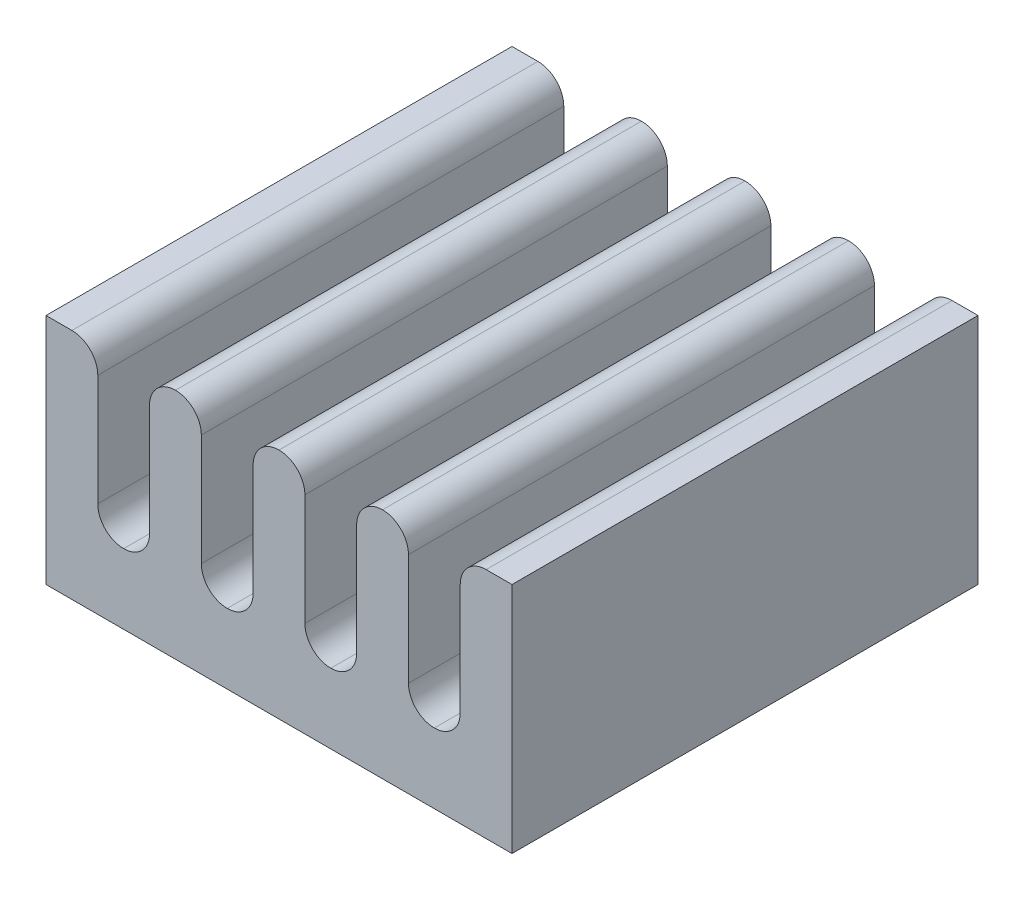
ISO-10303-21;
HEADER;
FILE_DESCRIPTION(('STEP AP214'),'2;1');
FILE_NAME('part.step','',(''),(''),'','','');
FILE_SCHEMA(('AUTOMOTIVE_DESIGN { 1 0 10303 214 1 1 1 1 }'));
ENDSEC;
DATA;
#1=APPLICATION_CONTEXT('core data for automotive mechanical design processes');
#2=APPLICATION_PROTOCOL_DEFINITION('international standard','automotive_design',2000,#1);
#3=PRODUCT_CONTEXT('',#1,'mechanical');
#4=PRODUCT('Part','Part','',(#3));
#5=PRODUCT_RELATED_PRODUCT_CATEGORY('part','',(#4));
#6=PRODUCT_DEFINITION_FORMATION('','',#4);
#7=PRODUCT_DEFINITION_CONTEXT('part definition',#1,'design');
#8=PRODUCT_DEFINITION('design','',#6,#7);
#9=PRODUCT_DEFINITION_SHAPE('','',#8);
#10=(LENGTH_UNIT() NAMED_UNIT(*) SI_UNIT(.MILLI.,.METRE.));
#11=(NAMED_UNIT(*) PLANE_ANGLE_UNIT() SI_UNIT($,.RADIAN.));
#12=(NAMED_UNIT(*) SI_UNIT($,.STERADIAN.) SOLID_ANGLE_UNIT());
#13=UNCERTAINTY_MEASURE_WITH_UNIT(LENGTH_MEASURE(1.E-05),#10,'distance_accuracy_value','');
#14=(GEOMETRIC_REPRESENTATION_CONTEXT(3) GLOBAL_UNCERTAINTY_ASSIGNED_CONTEXT((#13)) GLOBAL_UNIT_ASSIGNED_CONTEXT((#10,
#11,#12)) REPRESENTATION_CONTEXT('',''));
#15=CARTESIAN_POINT('',(0.,0.,0.));
#16=DIRECTION('',(0.,0.,1.));
#17=DIRECTION('',(1.,0.,0.));
#18=AXIS2_PLACEMENT_3D('',#15,#16,#17);
#19=CARTESIAN_POINT('',(4.5,5.,-4.5));
#20=DIRECTION('',(-1.,0.,0.));
#21=DIRECTION('',(0.,0.,1.));
#22=AXIS2_PLACEMENT_3D('',#19,#20,#21);
#23=PLANE('',#22);
#24=DIRECTION('',(0.,0.,1.));
#25=VECTOR('',#24,1.);
#26=CARTESIAN_POINT('',(4.5,0.5,-4.5));
#27=LINE('',#26,#25);
#28=CARTESIAN_POINT('',(4.5,0.5,-4.5));
#29=VERTEX_POINT('',#28);
#30=CARTESIAN_POINT('',(4.5,0.5,4.5));
#31=VERTEX_POINT('',#30);
#32=EDGE_CURVE('E11',#29,#31,#27,.T.);
#33=ORIENTED_EDGE('',*,*,#32,.F.);
#34=DIRECTION('',(0.,-1.,0.));
#35=VECTOR('',#34,1.);
#36=CARTESIAN_POINT('',(4.5,5.,-4.5));
#37=LINE('',#36,#35);
#38=CARTESIAN_POINT('',(4.5,5.,-4.5));
#39=VERTEX_POINT('',#38);
#40=EDGE_CURVE('E23',#39,#29,#37,.T.);
#41=ORIENTED_EDGE('',*,*,#40,.F.);
#42=DIRECTION('',(0.,0.,-1.));
#43=VECTOR('',#42,1.);
#44=CARTESIAN_POINT('',(4.5,5.,-4.5));
#45=LINE('',#44,#43);
#46=CARTESIAN_POINT('',(4.5,5.,4.5));
#47=VERTEX_POINT('',#46);
#48=EDGE_CURVE('E478',#47,#39,#45,.T.);
#49=ORIENTED_EDGE('',*,*,#48,.F.);
#50=DIRECTION('',(0.,-1.,0.));
#51=VECTOR('',#50,1.);
#52=CARTESIAN_POINT('',(4.5,5.,4.5));
#53=LINE('',#52,#51);
#54=EDGE_CURVE('E476',#47,#31,#53,.T.);
#55=ORIENTED_EDGE('',*,*,#54,.T.);
#56=EDGE_LOOP('',(#33,#41,#49,#55));
#57=FACE_BOUND('',#56,.T.);
#58=ADVANCED_FACE('F16',(#57),#23,.F.);
#59=CARTESIAN_POINT('',(-4.5,5.,-4.5));
#60=DIRECTION('',(0.,0.,1.));
#61=DIRECTION('',(1.,0.,0.));
#62=AXIS2_PLACEMENT_3D('',#59,#60,#61);
#63=PLANE('',#62);
#64=DIRECTION('',(1.,0.,0.));
#65=VECTOR('',#64,1.);
#66=CARTESIAN_POINT('',(-4.5,0.5,-4.5));
#67=LINE('',#66,#65);
#68=CARTESIAN_POINT('',(-4.5,0.5,-4.5));
#69=VERTEX_POINT('',#68);
#70=EDGE_CURVE('E474',#69,#29,#67,.T.);
#71=ORIENTED_EDGE('',*,*,#70,.F.);
#72=DIRECTION('',(0.,-1.,0.));
#73=VECTOR('',#72,1.);
#74=CARTESIAN_POINT('',(-4.5,5.,-4.5));
#75=LINE('',#74,#73);
#76=CARTESIAN_POINT('',(-4.5,5.,-4.5));
#77=VERTEX_POINT('',#76);
#78=EDGE_CURVE('E471',#77,#69,#75,.T.);
#79=ORIENTED_EDGE('',*,*,#78,.F.);
#80=DIRECTION('',(-1.,0.,0.));
#81=VECTOR('',#80,1.);
#82=CARTESIAN_POINT('',(-4.5,5.,-4.5));
#83=LINE('',#82,#81);
#84=CARTESIAN_POINT('',(-4.,5.,-4.5));
#85=VERTEX_POINT('',#84);
#86=EDGE_CURVE('E468',#85,#77,#83,.T.);
#87=ORIENTED_EDGE('',*,*,#86,.F.);
#88=CARTESIAN_POINT('',(-4.,4.5,-4.5));
#89=DIRECTION('',(0.,0.,-1.));
#90=DIRECTION('',(1.,0.,0.));
#91=AXIS2_PLACEMENT_3D('',#88,#89,#90);
#92=CIRCLE('',#91,0.5);
#93=CARTESIAN_POINT('',(-3.5,4.5,-4.5));
#94=VERTEX_POINT('',#93);
#95=EDGE_CURVE('E466',#85,#94,#92,.T.);
#96=ORIENTED_EDGE('',*,*,#95,.T.);
#97=DIRECTION('',(0.,1.,0.));
#98=VECTOR('',#97,1.);
#99=CARTESIAN_POINT('',(-3.5,-9.05538513813741,-4.5));
#100=LINE('',#99,#98);
#101=CARTESIAN_POINT('',(-3.5,2.35,-4.5));
#102=VERTEX_POINT('',#101);
#103=EDGE_CURVE('E463',#102,#94,#100,.T.);
#104=ORIENTED_EDGE('',*,*,#103,.F.);
#105=CARTESIAN_POINT('',(-3.,2.35,-4.5));
#106=DIRECTION('',(0.,0.,1.));
#107=DIRECTION('',(1.,0.,0.));
#108=AXIS2_PLACEMENT_3D('',#105,#106,#107);
#109=CIRCLE('',#108,0.5);
#110=CARTESIAN_POINT('',(-3.,1.85,-4.5));
#111=VERTEX_POINT('',#110);
#112=EDGE_CURVE('E461',#102,#111,#109,.T.);
#113=ORIENTED_EDGE('',*,*,#112,.T.);
#114=CARTESIAN_POINT('',(-3.,2.35,-4.5));
#115=DIRECTION('',(0.,0.,1.));
#116=DIRECTION('',(1.,0.,0.));
#117=AXIS2_PLACEMENT_3D('',#114,#115,#116);
#118=CIRCLE('',#117,0.5);
#119=CARTESIAN_POINT('',(-2.5,2.35,-4.5));
#120=VERTEX_POINT('',#119);
#121=EDGE_CURVE('E459',#111,#120,#118,.T.);
#122=ORIENTED_EDGE('',*,*,#121,.T.);
#123=DIRECTION('',(0.,1.,0.));
#124=VECTOR('',#123,1.);
#125=CARTESIAN_POINT('',(-2.5,-9.05538513813741,-4.5));
#126=LINE('',#125,#124);
#127=CARTESIAN_POINT('',(-2.5,4.5,-4.5));
#128=VERTEX_POINT('',#127);
#129=EDGE_CURVE('E457',#120,#128,#126,.T.);
#130=ORIENTED_EDGE('',*,*,#129,.T.);
#131=CARTESIAN_POINT('',(-2.,4.5,-4.5));
#132=DIRECTION('',(0.,0.,-1.));
#133=DIRECTION('',(1.,0.,0.));
#134=AXIS2_PLACEMENT_3D('',#131,#132,#133);
#135=CIRCLE('',#134,0.5);
#136=CARTESIAN_POINT('',(-2.,5.,-4.5));
#137=VERTEX_POINT('',#136);
#138=EDGE_CURVE('E455',#128,#137,#135,.T.);
#139=ORIENTED_EDGE('',*,*,#138,.T.);
#140=CARTESIAN_POINT('',(-2.,4.5,-4.5));
#141=DIRECTION('',(0.,0.,-1.));
#142=DIRECTION('',(1.,0.,0.));
#143=AXIS2_PLACEMENT_3D('',#140,#141,#142);
#144=CIRCLE('',#143,0.5);
#145=CARTESIAN_POINT('',(-1.5,4.5,-4.5));
#146=VERTEX_POINT('',#145);
#147=EDGE_CURVE('E453',#137,#146,#144,.T.);
#148=ORIENTED_EDGE('',*,*,#147,.T.);
#149=DIRECTION('',(0.,1.,0.));
#150=VECTOR('',#149,1.);
#151=CARTESIAN_POINT('',(-1.5,-9.05538513813741,-4.5));
#152=LINE('',#151,#150);
#153=CARTESIAN_POINT('',(-1.5,2.35,-4.5));
#154=VERTEX_POINT('',#153);
#155=EDGE_CURVE('E450',#154,#146,#152,.T.);
#156=ORIENTED_EDGE('',*,*,#155,.F.);
#157=CARTESIAN_POINT('',(-1.,2.35,-4.5));
#158=DIRECTION('',(0.,0.,1.));
#159=DIRECTION('',(1.,0.,0.));
#160=AXIS2_PLACEMENT_3D('',#157,#158,#159);
#161=CIRCLE('',#160,0.5);
#162=CARTESIAN_POINT('',(-1.,1.85,-4.5));
#163=VERTEX_POINT('',#162);
#164=EDGE_CURVE('E448',#154,#163,#161,.T.);
#165=ORIENTED_EDGE('',*,*,#164,.T.);
#166=CARTESIAN_POINT('',(-1.,2.35,-4.5));
#167=DIRECTION('',(0.,0.,1.));
#168=DIRECTION('',(1.,0.,0.));
#169=AXIS2_PLACEMENT_3D('',#166,#167,#168);
#170=CIRCLE('',#169,0.5);
#171=CARTESIAN_POINT('',(-0.5,2.35,-4.5));
#172=VERTEX_POINT('',#171);
#173=EDGE_CURVE('E446',#163,#172,#170,.T.);
#174=ORIENTED_EDGE('',*,*,#173,.T.);
#175=DIRECTION('',(0.,1.,0.));
#176=VECTOR('',#175,1.);
#177=CARTESIAN_POINT('',(-0.5,-9.05538513813741,-4.5));
#178=LINE('',#177,#176);
#179=CARTESIAN_POINT('',(-0.5,4.5,-4.5));
#180=VERTEX_POINT('',#179);
#181=EDGE_CURVE('E444',#172,#180,#178,.T.);
#182=ORIENTED_EDGE('',*,*,#181,.T.);
#183=CARTESIAN_POINT('',(0.,4.5,-4.5));
#184=DIRECTION('',(0.,0.,-1.));
#185=DIRECTION('',(1.,0.,0.));
#186=AXIS2_PLACEMENT_3D('',#183,#184,#185);
#187=CIRCLE('',#186,0.5);
#188=CARTESIAN_POINT('',(0.,5.,-4.5));
#189=VERTEX_POINT('',#188);
#190=EDGE_CURVE('E442',#180,#189,#187,.T.);
#191=ORIENTED_EDGE('',*,*,#190,.T.);
#192=CARTESIAN_POINT('',(0.,4.5,-4.5));
#193=DIRECTION('',(0.,0.,-1.));
#194=DIRECTION('',(1.,0.,0.));
#195=AXIS2_PLACEMENT_3D('',#192,#193,#194);
#196=CIRCLE('',#195,0.5);
#197=CARTESIAN_POINT('',(0.5,4.5,-4.5));
#198=VERTEX_POINT('',#197);
#199=EDGE_CURVE('E440',#189,#198,#196,.T.);
#200=ORIENTED_EDGE('',*,*,#199,.T.);
#201=DIRECTION('',(0.,1.,0.));
#202=VECTOR('',#201,1.);
#203=CARTESIAN_POINT('',(0.5,-9.05538513813741,-4.5));
#204=LINE('',#203,#202);
#205=CARTESIAN_POINT('',(0.5,2.35,-4.5));
#206=VERTEX_POINT('',#205);
#207=EDGE_CURVE('E437',#206,#198,#204,.T.);
#208=ORIENTED_EDGE('',*,*,#207,.F.);
#209=CARTESIAN_POINT('',(1.,2.35,-4.5));
#210=DIRECTION('',(0.,0.,1.));
#211=DIRECTION('',(1.,0.,0.));
#212=AXIS2_PLACEMENT_3D('',#209,#210,#211);
#213=CIRCLE('',#212,0.5);
#214=CARTESIAN_POINT('',(1.,1.85,-4.5));
#215=VERTEX_POINT('',#214);
#216=EDGE_CURVE('E435',#206,#215,#213,.T.);
#217=ORIENTED_EDGE('',*,*,#216,.T.);
#218=CARTESIAN_POINT('',(1.,2.35,-4.5));
#219=DIRECTION('',(0.,0.,1.));
#220=DIRECTION('',(1.,0.,0.));
#221=AXIS2_PLACEMENT_3D('',#218,#219,#220);
#222=CIRCLE('',#221,0.5);
#223=CARTESIAN_POINT('',(1.5,2.35,-4.5));
#224=VERTEX_POINT('',#223);
#225=EDGE_CURVE('E433',#215,#224,#222,.T.);
#226=ORIENTED_EDGE('',*,*,#225,.T.);
#227=DIRECTION('',(0.,1.,0.));
#228=VECTOR('',#227,1.);
#229=CARTESIAN_POINT('',(1.5,-9.05538513813741,-4.5));
#230=LINE('',#229,#228);
#231=CARTESIAN_POINT('',(1.5,4.5,-4.5));
#232=VERTEX_POINT('',#231);
#233=EDGE_CURVE('E431',#224,#232,#230,.T.);
#234=ORIENTED_EDGE('',*,*,#233,.T.);
#235=CARTESIAN_POINT('',(2.,4.5,-4.5));
#236=DIRECTION('',(0.,0.,-1.));
#237=DIRECTION('',(1.,0.,0.));
#238=AXIS2_PLACEMENT_3D('',#235,#236,#237);
#239=CIRCLE('',#238,0.5);
#240=CARTESIAN_POINT('',(2.,5.,-4.5));
#241=VERTEX_POINT('',#240);
#242=EDGE_CURVE('E429',#232,#241,#239,.T.);
#243=ORIENTED_EDGE('',*,*,#242,.T.);
#244=CARTESIAN_POINT('',(2.,4.5,-4.5));
#245=DIRECTION('',(0.,0.,-1.));
#246=DIRECTION('',(1.,0.,0.));
#247=AXIS2_PLACEMENT_3D('',#244,#245,#246);
#248=CIRCLE('',#247,0.5);
#249=CARTESIAN_POINT('',(2.5,4.5,-4.5));
#250=VERTEX_POINT('',#249);
#251=EDGE_CURVE('E427',#241,#250,#248,.T.);
#252=ORIENTED_EDGE('',*,*,#251,.T.);
#253=DIRECTION('',(0.,1.,0.));
#254=VECTOR('',#253,1.);
#255=CARTESIAN_POINT('',(2.5,-9.05538513813741,-4.5));
#256=LINE('',#255,#254);
#257=CARTESIAN_POINT('',(2.5,2.35,-4.5));
#258=VERTEX_POINT('',#257);
#259=EDGE_CURVE('E424',#258,#250,#256,.T.);
#260=ORIENTED_EDGE('',*,*,#259,.F.);
#261=CARTESIAN_POINT('',(3.,2.35,-4.5));
#262=DIRECTION('',(0.,0.,1.));
#263=DIRECTION('',(1.,0.,0.));
#264=AXIS2_PLACEMENT_3D('',#261,#262,#263);
#265=CIRCLE('',#264,0.5);
#266=CARTESIAN_POINT('',(3.,1.85,-4.5));
#267=VERTEX_POINT('',#266);
#268=EDGE_CURVE('E422',#258,#267,#265,.T.);
#269=ORIENTED_EDGE('',*,*,#268,.T.);
#270=CARTESIAN_POINT('',(3.,2.35,-4.5));
#271=DIRECTION('',(0.,0.,1.));
#272=DIRECTION('',(1.,0.,0.));
#273=AXIS2_PLACEMENT_3D('',#270,#271,#272);
#274=CIRCLE('',#273,0.5);
#275=CARTESIAN_POINT('',(3.5,2.35,-4.5));
#276=VERTEX_POINT('',#275);
#277=EDGE_CURVE('E420',#267,#276,#274,.T.);
#278=ORIENTED_EDGE('',*,*,#277,.T.);
#279=DIRECTION('',(0.,1.,0.));
#280=VECTOR('',#279,1.);
#281=CARTESIAN_POINT('',(3.5,-9.05538513813741,-4.5));
#282=LINE('',#281,#280);
#283=CARTESIAN_POINT('',(3.5,4.5,-4.5));
#284=VERTEX_POINT('',#283);
#285=EDGE_CURVE('E418',#276,#284,#282,.T.);
#286=ORIENTED_EDGE('',*,*,#285,.T.);
#287=CARTESIAN_POINT('',(4.,4.5,-4.5));
#288=DIRECTION('',(0.,0.,-1.));
#289=DIRECTION('',(1.,0.,0.));
#290=AXIS2_PLACEMENT_3D('',#287,#288,#289);
#291=CIRCLE('',#290,0.5);
#292=CARTESIAN_POINT('',(4.,5.,-4.5));
#293=VERTEX_POINT('',#292);
#294=EDGE_CURVE('E416',#284,#293,#291,.T.);
#295=ORIENTED_EDGE('',*,*,#294,.T.);
#296=DIRECTION('',(-1.,0.,0.));
#297=VECTOR('',#296,1.);
#298=CARTESIAN_POINT('',(-4.5,5.,-4.5));
#299=LINE('',#298,#297);
#300=EDGE_CURVE('E413',#39,#293,#299,.T.);
#301=ORIENTED_EDGE('',*,*,#300,.F.);
#302=ORIENTED_EDGE('',*,*,#40,.T.);
#303=EDGE_LOOP('',(#71,#79,#87,#96,#104,#113,#122,#130,#139,#148,#156,#165,#174,#182,#191,#200,
#208,#217,#226,#234,#243,#252,#260,#269,#278,#286,#295,#301,#302));
#304=FACE_BOUND('',#303,.T.);
#305=ADVANCED_FACE('F482',(#304),#63,.F.);
#306=CARTESIAN_POINT('',(-4.5,5.,-4.5));
#307=DIRECTION('',(1.,0.,0.));
#308=DIRECTION('',(0.,0.,-1.));
#309=AXIS2_PLACEMENT_3D('',#306,#307,#308);
#310=PLANE('',#309);
#311=DIRECTION('',(0.,0.,-1.));
#312=VECTOR('',#311,1.);
#313=CARTESIAN_POINT('',(-4.5,0.5,-4.5));
#314=LINE('',#313,#312);
#315=CARTESIAN_POINT('',(-4.5,0.5,4.5));
#316=VERTEX_POINT('',#315);
#317=EDGE_CURVE('E410',#316,#69,#314,.T.);
#318=ORIENTED_EDGE('',*,*,#317,.F.);
#319=DIRECTION('',(0.,-1.,0.));
#320=VECTOR('',#319,1.);
#321=CARTESIAN_POINT('',(-4.5,5.,4.5));
#322=LINE('',#321,#320);
#323=CARTESIAN_POINT('',(-4.5,5.,4.5));
#324=VERTEX_POINT('',#323);
#325=EDGE_CURVE('E407',#324,#316,#322,.T.);
#326=ORIENTED_EDGE('',*,*,#325,.F.);
#327=DIRECTION('',(0.,0.,1.));
#328=VECTOR('',#327,1.);
#329=CARTESIAN_POINT('',(-4.5,5.,-4.5));
#330=LINE('',#329,#328);
#331=EDGE_CURVE('E404',#77,#324,#330,.T.);
#332=ORIENTED_EDGE('',*,*,#331,.F.);
#333=ORIENTED_EDGE('',*,*,#78,.T.);
#334=EDGE_LOOP('',(#318,#326,#332,#333));
#335=FACE_BOUND('',#334,.T.);
#336=ADVANCED_FACE('F486',(#335),#310,.F.);
#337=CARTESIAN_POINT('',(-4.5,5.,4.5));
#338=DIRECTION('',(0.,0.,-1.));
#339=DIRECTION('',(-1.,0.,0.));
#340=AXIS2_PLACEMENT_3D('',#337,#338,#339);
#341=PLANE('',#340);
#342=DIRECTION('',(-1.,0.,0.));
#343=VECTOR('',#342,1.);
#344=CARTESIAN_POINT('',(-4.5,0.5,4.5));
#345=LINE('',#344,#343);
#346=EDGE_CURVE('E402',#31,#316,#345,.T.);
#347=ORIENTED_EDGE('',*,*,#346,.F.);
#348=ORIENTED_EDGE('',*,*,#54,.F.);
#349=DIRECTION('',(1.,0.,0.));
#350=VECTOR('',#349,1.);
#351=CARTESIAN_POINT('',(-4.5,5.,4.5));
#352=LINE('',#351,#350);
#353=CARTESIAN_POINT('',(4.,5.,4.5));
#354=VERTEX_POINT('',#353);
#355=EDGE_CURVE('E399',#354,#47,#352,.T.);
#356=ORIENTED_EDGE('',*,*,#355,.F.);
#357=CARTESIAN_POINT('',(4.,4.5,4.5));
#358=DIRECTION('',(0.,0.,1.));
#359=DIRECTION('',(-1.,0.,0.));
#360=AXIS2_PLACEMENT_3D('',#357,#358,#359);
#361=CIRCLE('',#360,0.5);
#362=CARTESIAN_POINT('',(3.5,4.5,4.5));
#363=VERTEX_POINT('',#362);
#364=EDGE_CURVE('E397',#354,#363,#361,.T.);
#365=ORIENTED_EDGE('',*,*,#364,.T.);
#366=DIRECTION('',(0.,1.,0.));
#367=VECTOR('',#366,1.);
#368=CARTESIAN_POINT('',(3.5,-9.05538513813741,4.5));
#369=LINE('',#368,#367);
#370=CARTESIAN_POINT('',(3.5,2.35,4.5));
#371=VERTEX_POINT('',#370);
#372=EDGE_CURVE('E394',#371,#363,#369,.T.);
#373=ORIENTED_EDGE('',*,*,#372,.F.);
#374=CARTESIAN_POINT('',(3.,2.35,4.5));
#375=DIRECTION('',(0.,0.,-1.));
#376=DIRECTION('',(-1.,0.,0.));
#377=AXIS2_PLACEMENT_3D('',#374,#375,#376);
#378=CIRCLE('',#377,0.5);
#379=CARTESIAN_POINT('',(3.,1.85,4.5));
#380=VERTEX_POINT('',#379);
#381=EDGE_CURVE('E392',#371,#380,#378,.T.);
#382=ORIENTED_EDGE('',*,*,#381,.T.);
#383=CARTESIAN_POINT('',(3.,2.35,4.5));
#384=DIRECTION('',(0.,0.,-1.));
#385=DIRECTION('',(-1.,0.,0.));
#386=AXIS2_PLACEMENT_3D('',#383,#384,#385);
#387=CIRCLE('',#386,0.5);
#388=CARTESIAN_POINT('',(2.5,2.35,4.5));
#389=VERTEX_POINT('',#388);
#390=EDGE_CURVE('E390',#380,#389,#387,.T.);
#391=ORIENTED_EDGE('',*,*,#390,.T.);
#392=DIRECTION('',(0.,1.,0.));
#393=VECTOR('',#392,1.);
#394=CARTESIAN_POINT('',(2.5,-9.05538513813741,4.5));
#395=LINE('',#394,#393);
#396=CARTESIAN_POINT('',(2.5,4.5,4.5));
#397=VERTEX_POINT('',#396);
#398=EDGE_CURVE('E388',#389,#397,#395,.T.);
#399=ORIENTED_EDGE('',*,*,#398,.T.);
#400=CARTESIAN_POINT('',(2.,4.5,4.5));
#401=DIRECTION('',(0.,0.,1.));
#402=DIRECTION('',(-1.,0.,0.));
#403=AXIS2_PLACEMENT_3D('',#400,#401,#402);
#404=CIRCLE('',#403,0.5);
#405=CARTESIAN_POINT('',(2.,5.,4.5));
#406=VERTEX_POINT('',#405);
#407=EDGE_CURVE('E386',#397,#406,#404,.T.);
#408=ORIENTED_EDGE('',*,*,#407,.T.);
#409=CARTESIAN_POINT('',(2.,4.5,4.5));
#410=DIRECTION('',(0.,0.,1.));
#411=DIRECTION('',(-1.,0.,0.));
#412=AXIS2_PLACEMENT_3D('',#409,#410,#411);
#413=CIRCLE('',#412,0.5);
#414=CARTESIAN_POINT('',(1.5,4.5,4.5));
#415=VERTEX_POINT('',#414);
#416=EDGE_CURVE('E384',#406,#415,#413,.T.);
#417=ORIENTED_EDGE('',*,*,#416,.T.);
#418=DIRECTION('',(0.,1.,0.));
#419=VECTOR('',#418,1.);
#420=CARTESIAN_POINT('',(1.5,-9.05538513813741,4.5));
#421=LINE('',#420,#419);
#422=CARTESIAN_POINT('',(1.5,2.35,4.5));
#423=VERTEX_POINT('',#422);
#424=EDGE_CURVE('E381',#423,#415,#421,.T.);
#425=ORIENTED_EDGE('',*,*,#424,.F.);
#426=CARTESIAN_POINT('',(1.,2.35,4.5));
#427=DIRECTION('',(0.,0.,-1.));
#428=DIRECTION('',(-1.,0.,0.));
#429=AXIS2_PLACEMENT_3D('',#426,#427,#428);
#430=CIRCLE('',#429,0.5);
#431=CARTESIAN_POINT('',(1.,1.85,4.5));
#432=VERTEX_POINT('',#431);
#433=EDGE_CURVE('E379',#423,#432,#430,.T.);
#434=ORIENTED_EDGE('',*,*,#433,.T.);
#435=CARTESIAN_POINT('',(1.,2.35,4.5));
#436=DIRECTION('',(0.,0.,-1.));
#437=DIRECTION('',(-1.,0.,0.));
#438=AXIS2_PLACEMENT_3D('',#435,#436,#437);
#439=CIRCLE('',#438,0.5);
#440=CARTESIAN_POINT('',(0.500000000000001,2.35,4.5));
#441=VERTEX_POINT('',#440);
#442=EDGE_CURVE('E377',#432,#441,#439,.T.);
#443=ORIENTED_EDGE('',*,*,#442,.T.);
#444=DIRECTION('',(0.,1.,0.));
#445=VECTOR('',#444,1.);
#446=CARTESIAN_POINT('',(0.500000000000001,-9.05538513813741,4.5));
#447=LINE('',#446,#445);
#448=CARTESIAN_POINT('',(0.500000000000001,4.5,4.5));
#449=VERTEX_POINT('',#448);
#450=EDGE_CURVE('E375',#441,#449,#447,.T.);
#451=ORIENTED_EDGE('',*,*,#450,.T.);
#452=CARTESIAN_POINT('',(0.,4.5,4.5));
#453=DIRECTION('',(0.,0.,1.));
#454=DIRECTION('',(-1.,0.,0.));
#455=AXIS2_PLACEMENT_3D('',#452,#453,#454);
#456=CIRCLE('',#455,0.5);
#457=CARTESIAN_POINT('',(0.,5.,4.5));
#458=VERTEX_POINT('',#457);
#459=EDGE_CURVE('E373',#449,#458,#456,.T.);
#460=ORIENTED_EDGE('',*,*,#459,.T.);
#461=CARTESIAN_POINT('',(0.,4.5,4.5));
#462=DIRECTION('',(0.,0.,1.));
#463=DIRECTION('',(-1.,0.,0.));
#464=AXIS2_PLACEMENT_3D('',#461,#462,#463);
#465=CIRCLE('',#464,0.5);
#466=CARTESIAN_POINT('',(-0.499999999999999,4.5,4.5));
#467=VERTEX_POINT('',#466);
#468=EDGE_CURVE('E371',#458,#467,#465,.T.);
#469=ORIENTED_EDGE('',*,*,#468,.T.);
#470=DIRECTION('',(0.,1.,0.));
#471=VECTOR('',#470,1.);
#472=CARTESIAN_POINT('',(-0.499999999999999,-9.05538513813741,4.5));
#473=LINE('',#472,#471);
#474=CARTESIAN_POINT('',(-0.499999999999999,2.35,4.5));
#475=VERTEX_POINT('',#474);
#476=EDGE_CURVE('E368',#475,#467,#473,.T.);
#477=ORIENTED_EDGE('',*,*,#476,.F.);
#478=CARTESIAN_POINT('',(-0.999999999999999,2.35,4.5));
#479=DIRECTION('',(0.,0.,-1.));
#480=DIRECTION('',(-1.,0.,0.));
#481=AXIS2_PLACEMENT_3D('',#478,#479,#480);
#482=CIRCLE('',#481,0.5);
#483=CARTESIAN_POINT('',(-0.999999999999999,1.85,4.5));
#484=VERTEX_POINT('',#483);
#485=EDGE_CURVE('E366',#475,#484,#482,.T.);
#486=ORIENTED_EDGE('',*,*,#485,.T.);
#487=CARTESIAN_POINT('',(-0.999999999999999,2.35,4.5));
#488=DIRECTION('',(0.,0.,-1.));
#489=DIRECTION('',(-1.,0.,0.));
#490=AXIS2_PLACEMENT_3D('',#487,#488,#489);
#491=CIRCLE('',#490,0.5);
#492=CARTESIAN_POINT('',(-1.5,2.35,4.5));
#493=VERTEX_POINT('',#492);
#494=EDGE_CURVE('E364',#484,#493,#491,.T.);
#495=ORIENTED_EDGE('',*,*,#494,.T.);
#496=DIRECTION('',(0.,1.,0.));
#497=VECTOR('',#496,1.);
#498=CARTESIAN_POINT('',(-1.5,-9.05538513813741,4.5));
#499=LINE('',#498,#497);
#500=CARTESIAN_POINT('',(-1.5,4.5,4.5));
#501=VERTEX_POINT('',#500);
#502=EDGE_CURVE('E362',#493,#501,#499,.T.);
#503=ORIENTED_EDGE('',*,*,#502,.T.);
#504=CARTESIAN_POINT('',(-2.,4.5,4.5));
#505=DIRECTION('',(0.,0.,1.));
#506=DIRECTION('',(-1.,0.,0.));
#507=AXIS2_PLACEMENT_3D('',#504,#505,#506);
#508=CIRCLE('',#507,0.5);
#509=CARTESIAN_POINT('',(-2.,5.,4.5));
#510=VERTEX_POINT('',#509);
#511=EDGE_CURVE('E360',#501,#510,#508,.T.);
#512=ORIENTED_EDGE('',*,*,#511,.T.);
#513=CARTESIAN_POINT('',(-2.,4.5,4.5));
#514=DIRECTION('',(0.,0.,1.));
#515=DIRECTION('',(-1.,0.,0.));
#516=AXIS2_PLACEMENT_3D('',#513,#514,#515);
#517=CIRCLE('',#516,0.5);
#518=CARTESIAN_POINT('',(-2.5,4.5,4.5));
#519=VERTEX_POINT('',#518);
#520=EDGE_CURVE('E358',#510,#519,#517,.T.);
#521=ORIENTED_EDGE('',*,*,#520,.T.);
#522=DIRECTION('',(0.,1.,0.));
#523=VECTOR('',#522,1.);
#524=CARTESIAN_POINT('',(-2.5,-9.05538513813741,4.5));
#525=LINE('',#524,#523);
#526=CARTESIAN_POINT('',(-2.5,2.35,4.5));
#527=VERTEX_POINT('',#526);
#528=EDGE_CURVE('E355',#527,#519,#525,.T.);
#529=ORIENTED_EDGE('',*,*,#528,.F.);
#530=CARTESIAN_POINT('',(-3.,2.35,4.5));
#531=DIRECTION('',(0.,0.,-1.));
#532=DIRECTION('',(-1.,0.,0.));
#533=AXIS2_PLACEMENT_3D('',#530,#531,#532);
#534=CIRCLE('',#533,0.5);
#535=CARTESIAN_POINT('',(-3.,1.85,4.5));
#536=VERTEX_POINT('',#535);
#537=EDGE_CURVE('E353',#527,#536,#534,.T.);
#538=ORIENTED_EDGE('',*,*,#537,.T.);
#539=CARTESIAN_POINT('',(-3.,2.35,4.5));
#540=DIRECTION('',(0.,0.,-1.));
#541=DIRECTION('',(-1.,0.,0.));
#542=AXIS2_PLACEMENT_3D('',#539,#540,#541);
#543=CIRCLE('',#542,0.5);
#544=CARTESIAN_POINT('',(-3.5,2.35,4.5));
#545=VERTEX_POINT('',#544);
#546=EDGE_CURVE('E351',#536,#545,#543,.T.);
#547=ORIENTED_EDGE('',*,*,#546,.T.);
#548=DIRECTION('',(0.,1.,0.));
#549=VECTOR('',#548,1.);
#550=CARTESIAN_POINT('',(-3.5,-9.05538513813741,4.5));
#551=LINE('',#550,#549);
#552=CARTESIAN_POINT('',(-3.5,4.5,4.5));
#553=VERTEX_POINT('',#552);
#554=EDGE_CURVE('E349',#545,#553,#551,.T.);
#555=ORIENTED_EDGE('',*,*,#554,.T.);
#556=CARTESIAN_POINT('',(-4.,4.5,4.5));
#557=DIRECTION('',(0.,0.,1.));
#558=DIRECTION('',(-1.,0.,0.));
#559=AXIS2_PLACEMENT_3D('',#556,#557,#558);
#560=CIRCLE('',#559,0.5);
#561=CARTESIAN_POINT('',(-4.,5.,4.5));
#562=VERTEX_POINT('',#561);
#563=EDGE_CURVE('E347',#553,#562,#560,.T.);
#564=ORIENTED_EDGE('',*,*,#563,.T.);
#565=DIRECTION('',(1.,0.,0.));
#566=VECTOR('',#565,1.);
#567=CARTESIAN_POINT('',(-4.5,5.,4.5));
#568=LINE('',#567,#566);
#569=EDGE_CURVE('E344',#324,#562,#568,.T.);
#570=ORIENTED_EDGE('',*,*,#569,.F.);
#571=ORIENTED_EDGE('',*,*,#325,.T.);
#572=EDGE_LOOP('',(#347,#348,#356,#365,#373,#382,#391,#399,#408,#417,#425,#434,#443,#451,#460,
#469,#477,#486,#495,#503,#512,#521,#529,#538,#547,#555,#564,#570,#571));
#573=FACE_BOUND('',#572,.T.);
#574=ADVANCED_FACE('F490',(#573),#341,.F.);
#575=CARTESIAN_POINT('',(0.,5.,0.));
#576=DIRECTION('',(0.,1.,0.));
#577=DIRECTION('',(0.,0.,1.));
#578=AXIS2_PLACEMENT_3D('',#575,#576,#577);
#579=PLANE('',#578);
#580=ORIENTED_EDGE('',*,*,#569,.T.);
#581=DIRECTION('',(0.,0.,-1.));
#582=VECTOR('',#581,1.);
#583=CARTESIAN_POINT('',(-4.,5.,-4.5));
#584=LINE('',#583,#582);
#585=EDGE_CURVE('E341',#562,#85,#584,.T.);
#586=ORIENTED_EDGE('',*,*,#585,.T.);
#587=ORIENTED_EDGE('',*,*,#86,.T.);
#588=ORIENTED_EDGE('',*,*,#331,.T.);
#589=EDGE_LOOP('',(#580,#586,#587,#588));
#590=FACE_BOUND('',#589,.T.);
#591=ADVANCED_FACE('F495',(#590),#579,.T.);
#592=CARTESIAN_POINT('',(0.,5.,0.));
#593=DIRECTION('',(0.,1.,0.));
#594=DIRECTION('',(0.,0.,1.));
#595=AXIS2_PLACEMENT_3D('',#592,#593,#594);
#596=PLANE('',#595);
#597=ORIENTED_EDGE('',*,*,#300,.T.);
#598=DIRECTION('',(0.,0.,1.));
#599=VECTOR('',#598,1.);
#600=CARTESIAN_POINT('',(4.,5.,4.5));
#601=LINE('',#600,#599);
#602=EDGE_CURVE('E338',#293,#354,#601,.T.);
#603=ORIENTED_EDGE('',*,*,#602,.T.);
#604=ORIENTED_EDGE('',*,*,#355,.T.);
#605=ORIENTED_EDGE('',*,*,#48,.T.);
#606=EDGE_LOOP('',(#597,#603,#604,#605));
#607=FACE_BOUND('',#606,.T.);
#608=ADVANCED_FACE('F608',(#607),#596,.T.);
#609=CARTESIAN_POINT('',(-3.5,-9.05538513813741,-4.5));
#610=DIRECTION('',(-1.,0.,0.));
#611=DIRECTION('',(0.,0.,1.));
#612=AXIS2_PLACEMENT_3D('',#609,#610,#611);
#613=PLANE('',#612);
#614=ORIENTED_EDGE('',*,*,#554,.F.);
#615=DIRECTION('',(0.,0.,-1.));
#616=VECTOR('',#615,1.);
#617=CARTESIAN_POINT('',(-3.5,2.35,-4.5));
#618=LINE('',#617,#616);
#619=EDGE_CURVE('E335',#545,#102,#618,.T.);
#620=ORIENTED_EDGE('',*,*,#619,.T.);
#621=ORIENTED_EDGE('',*,*,#103,.T.);
#622=DIRECTION('',(0.,0.,1.));
#623=VECTOR('',#622,1.);
#624=CARTESIAN_POINT('',(-3.5,4.5,4.5));
#625=LINE('',#624,#623);
#626=EDGE_CURVE('E332',#94,#553,#625,.T.);
#627=ORIENTED_EDGE('',*,*,#626,.T.);
#628=EDGE_LOOP('',(#614,#620,#621,#627));
#629=FACE_BOUND('',#628,.T.);
#630=ADVANCED_FACE('F503',(#629),#613,.F.);
#631=CARTESIAN_POINT('',(-2.5,-9.05538513813741,-4.5));
#632=DIRECTION('',(1.,0.,0.));
#633=DIRECTION('',(0.,0.,-1.));
#634=AXIS2_PLACEMENT_3D('',#631,#632,#633);
#635=PLANE('',#634);
#636=ORIENTED_EDGE('',*,*,#129,.F.);
#637=DIRECTION('',(0.,0.,1.));
#638=VECTOR('',#637,1.);
#639=CARTESIAN_POINT('',(-2.5,2.35,-4.5));
#640=LINE('',#639,#638);
#641=EDGE_CURVE('E329',#120,#527,#640,.T.);
#642=ORIENTED_EDGE('',*,*,#641,.T.);
#643=ORIENTED_EDGE('',*,*,#528,.T.);
#644=DIRECTION('',(0.,0.,-1.));
#645=VECTOR('',#644,1.);
#646=CARTESIAN_POINT('',(-2.5,4.5,-4.5));
#647=LINE('',#646,#645);
#648=EDGE_CURVE('E326',#519,#128,#647,.T.);
#649=ORIENTED_EDGE('',*,*,#648,.T.);
#650=EDGE_LOOP('',(#636,#642,#643,#649));
#651=FACE_BOUND('',#650,.T.);
#652=ADVANCED_FACE('F516',(#651),#635,.F.);
#653=CARTESIAN_POINT('',(-3.,2.35,-4.5));
#654=DIRECTION('',(0.,0.,1.));
#655=DIRECTION('',(1.,0.,0.));
#656=AXIS2_PLACEMENT_3D('',#653,#654,#655);
#657=CYLINDRICAL_SURFACE('',#656,0.5);
#658=DIRECTION('',(0.,0.,-1.));
#659=VECTOR('',#658,1.);
#660=CARTESIAN_POINT('',(-3.,1.85,0.));
#661=LINE('',#660,#659);
#662=EDGE_CURVE('E323',#536,#111,#661,.T.);
#663=ORIENTED_EDGE('',*,*,#662,.F.);
#664=ORIENTED_EDGE('',*,*,#537,.F.);
#665=ORIENTED_EDGE('',*,*,#641,.F.);
#666=ORIENTED_EDGE('',*,*,#121,.F.);
#667=EDGE_LOOP('',(#663,#664,#665,#666));
#668=FACE_BOUND('',#667,.T.);
#669=ADVANCED_FACE('F513',(#668),#657,.F.);
#670=CARTESIAN_POINT('',(-3.,2.35,-4.5));
#671=DIRECTION('',(0.,0.,-1.));
#672=DIRECTION('',(-1.,0.,0.));
#673=AXIS2_PLACEMENT_3D('',#670,#671,#672);
#674=CYLINDRICAL_SURFACE('',#673,0.5);
#675=ORIENTED_EDGE('',*,*,#546,.F.);
#676=ORIENTED_EDGE('',*,*,#662,.T.);
#677=ORIENTED_EDGE('',*,*,#112,.F.);
#678=ORIENTED_EDGE('',*,*,#619,.F.);
#679=EDGE_LOOP('',(#675,#676,#677,#678));
#680=FACE_BOUND('',#679,.T.);
#681=ADVANCED_FACE('F507',(#680),#674,.F.);
#682=CARTESIAN_POINT('',(-4.,4.5,-4.5));
#683=DIRECTION('',(0.,0.,-1.));
#684=DIRECTION('',(-1.,0.,0.));
#685=AXIS2_PLACEMENT_3D('',#682,#683,#684);
#686=CYLINDRICAL_SURFACE('',#685,0.5);
#687=ORIENTED_EDGE('',*,*,#95,.F.);
#688=ORIENTED_EDGE('',*,*,#585,.F.);
#689=ORIENTED_EDGE('',*,*,#563,.F.);
#690=ORIENTED_EDGE('',*,*,#626,.F.);
#691=EDGE_LOOP('',(#687,#688,#689,#690));
#692=FACE_BOUND('',#691,.T.);
#693=ADVANCED_FACE('F498',(#692),#686,.T.);
#694=CARTESIAN_POINT('',(-2.,4.5,-4.5));
#695=DIRECTION('',(0.,0.,1.));
#696=DIRECTION('',(1.,0.,0.));
#697=AXIS2_PLACEMENT_3D('',#694,#695,#696);
#698=CYLINDRICAL_SURFACE('',#697,0.5);
#699=ORIENTED_EDGE('',*,*,#520,.F.);
#700=DIRECTION('',(0.,0.,1.));
#701=VECTOR('',#700,1.);
#702=CARTESIAN_POINT('',(-2.,5.,4.5));
#703=LINE('',#702,#701);
#704=EDGE_CURVE('E320',#137,#510,#703,.T.);
#705=ORIENTED_EDGE('',*,*,#704,.F.);
#706=ORIENTED_EDGE('',*,*,#138,.F.);
#707=ORIENTED_EDGE('',*,*,#648,.F.);
#708=EDGE_LOOP('',(#699,#705,#706,#707));
#709=FACE_BOUND('',#708,.T.);
#710=ADVANCED_FACE('F523',(#709),#698,.T.);
#711=CARTESIAN_POINT('',(-1.5,-9.05538513813741,-4.5));
#712=DIRECTION('',(-1.,0.,0.));
#713=DIRECTION('',(0.,0.,1.));
#714=AXIS2_PLACEMENT_3D('',#711,#712,#713);
#715=PLANE('',#714);
#716=ORIENTED_EDGE('',*,*,#502,.F.);
#717=DIRECTION('',(0.,0.,-1.));
#718=VECTOR('',#717,1.);
#719=CARTESIAN_POINT('',(-1.5,2.35,-4.5));
#720=LINE('',#719,#718);
#721=EDGE_CURVE('E317',#493,#154,#720,.T.);
#722=ORIENTED_EDGE('',*,*,#721,.T.);
#723=ORIENTED_EDGE('',*,*,#155,.T.);
#724=DIRECTION('',(0.,0.,1.));
#725=VECTOR('',#724,1.);
#726=CARTESIAN_POINT('',(-1.5,4.5,4.5));
#727=LINE('',#726,#725);
#728=EDGE_CURVE('E314',#146,#501,#727,.T.);
#729=ORIENTED_EDGE('',*,*,#728,.T.);
#730=EDGE_LOOP('',(#716,#722,#723,#729));
#731=FACE_BOUND('',#730,.T.);
#732=ADVANCED_FACE('F531',(#731),#715,.F.);
#733=CARTESIAN_POINT('',(-0.5,-9.05538513813741,-4.5));
#734=DIRECTION('',(1.,0.,0.));
#735=DIRECTION('',(0.,0.,-1.));
#736=AXIS2_PLACEMENT_3D('',#733,#734,#735);
#737=PLANE('',#736);
#738=ORIENTED_EDGE('',*,*,#181,.F.);
#739=DIRECTION('',(0.,0.,1.));
#740=VECTOR('',#739,1.);
#741=CARTESIAN_POINT('',(-0.5,2.35,-4.5));
#742=LINE('',#741,#740);
#743=EDGE_CURVE('E311',#172,#475,#742,.T.);
#744=ORIENTED_EDGE('',*,*,#743,.T.);
#745=ORIENTED_EDGE('',*,*,#476,.T.);
#746=DIRECTION('',(0.,0.,-1.));
#747=VECTOR('',#746,1.);
#748=CARTESIAN_POINT('',(-0.5,4.5,-4.5));
#749=LINE('',#748,#747);
#750=EDGE_CURVE('E308',#467,#180,#749,.T.);
#751=ORIENTED_EDGE('',*,*,#750,.T.);
#752=EDGE_LOOP('',(#738,#744,#745,#751));
#753=FACE_BOUND('',#752,.T.);
#754=ADVANCED_FACE('F544',(#753),#737,.F.);
#755=CARTESIAN_POINT('',(0.5,-9.05538513813741,-4.5));
#756=DIRECTION('',(-1.,0.,0.));
#757=DIRECTION('',(0.,0.,1.));
#758=AXIS2_PLACEMENT_3D('',#755,#756,#757);
#759=PLANE('',#758);
#760=ORIENTED_EDGE('',*,*,#450,.F.);
#761=DIRECTION('',(0.,0.,-1.));
#762=VECTOR('',#761,1.);
#763=CARTESIAN_POINT('',(0.5,2.35,-4.5));
#764=LINE('',#763,#762);
#765=EDGE_CURVE('E305',#441,#206,#764,.T.);
#766=ORIENTED_EDGE('',*,*,#765,.T.);
#767=ORIENTED_EDGE('',*,*,#207,.T.);
#768=DIRECTION('',(0.,0.,1.));
#769=VECTOR('',#768,1.);
#770=CARTESIAN_POINT('',(0.500000000000001,4.5,4.5));
#771=LINE('',#770,#769);
#772=EDGE_CURVE('E302',#198,#449,#771,.T.);
#773=ORIENTED_EDGE('',*,*,#772,.T.);
#774=EDGE_LOOP('',(#760,#766,#767,#773));
#775=FACE_BOUND('',#774,.T.);
#776=ADVANCED_FACE('F559',(#775),#759,.F.);
#777=CARTESIAN_POINT('',(1.5,-9.05538513813741,-4.5));
#778=DIRECTION('',(1.,0.,0.));
#779=DIRECTION('',(0.,0.,-1.));
#780=AXIS2_PLACEMENT_3D('',#777,#778,#779);
#781=PLANE('',#780);
#782=ORIENTED_EDGE('',*,*,#233,.F.);
#783=DIRECTION('',(0.,0.,1.));
#784=VECTOR('',#783,1.);
#785=CARTESIAN_POINT('',(1.5,2.35,-4.5));
#786=LINE('',#785,#784);
#787=EDGE_CURVE('E299',#224,#423,#786,.T.);
#788=ORIENTED_EDGE('',*,*,#787,.T.);
#789=ORIENTED_EDGE('',*,*,#424,.T.);
#790=DIRECTION('',(0.,0.,-1.));
#791=VECTOR('',#790,1.);
#792=CARTESIAN_POINT('',(1.5,4.5,-4.5));
#793=LINE('',#792,#791);
#794=EDGE_CURVE('E296',#415,#232,#793,.T.);
#795=ORIENTED_EDGE('',*,*,#794,.T.);
#796=EDGE_LOOP('',(#782,#788,#789,#795));
#797=FACE_BOUND('',#796,.T.);
#798=ADVANCED_FACE('F572',(#797),#781,.F.);
#799=CARTESIAN_POINT('',(2.5,-9.05538513813741,-4.5));
#800=DIRECTION('',(-1.,0.,0.));
#801=DIRECTION('',(0.,0.,1.));
#802=AXIS2_PLACEMENT_3D('',#799,#800,#801);
#803=PLANE('',#802);
#804=ORIENTED_EDGE('',*,*,#398,.F.);
#805=DIRECTION('',(0.,0.,-1.));
#806=VECTOR('',#805,1.);
#807=CARTESIAN_POINT('',(2.5,2.35,-4.5));
#808=LINE('',#807,#806);
#809=EDGE_CURVE('E293',#389,#258,#808,.T.);
#810=ORIENTED_EDGE('',*,*,#809,.T.);
#811=ORIENTED_EDGE('',*,*,#259,.T.);
#812=DIRECTION('',(0.,0.,1.));
#813=VECTOR('',#812,1.);
#814=CARTESIAN_POINT('',(2.5,4.5,4.5));
#815=LINE('',#814,#813);
#816=EDGE_CURVE('E290',#250,#397,#815,.T.);
#817=ORIENTED_EDGE('',*,*,#816,.T.);
#818=EDGE_LOOP('',(#804,#810,#811,#817));
#819=FACE_BOUND('',#818,.T.);
#820=ADVANCED_FACE('F587',(#819),#803,.F.);
#821=CARTESIAN_POINT('',(3.5,-9.05538513813741,-4.5));
#822=DIRECTION('',(1.,0.,0.));
#823=DIRECTION('',(0.,0.,-1.));
#824=AXIS2_PLACEMENT_3D('',#821,#822,#823);
#825=PLANE('',#824);
#826=ORIENTED_EDGE('',*,*,#285,.F.);
#827=DIRECTION('',(0.,0.,1.));
#828=VECTOR('',#827,1.);
#829=CARTESIAN_POINT('',(3.5,2.35,-4.5));
#830=LINE('',#829,#828);
#831=EDGE_CURVE('E287',#276,#371,#830,.T.);
#832=ORIENTED_EDGE('',*,*,#831,.T.);
#833=ORIENTED_EDGE('',*,*,#372,.T.);
#834=DIRECTION('',(0.,0.,-1.));
#835=VECTOR('',#834,1.);
#836=CARTESIAN_POINT('',(3.5,4.5,-4.5));
#837=LINE('',#836,#835);
#838=EDGE_CURVE('E284',#363,#284,#837,.T.);
#839=ORIENTED_EDGE('',*,*,#838,.T.);
#840=EDGE_LOOP('',(#826,#832,#833,#839));
#841=FACE_BOUND('',#840,.T.);
#842=ADVANCED_FACE('F600',(#841),#825,.F.);
#843=CARTESIAN_POINT('',(-1.,2.35,-4.5));
#844=DIRECTION('',(0.,0.,1.));
#845=DIRECTION('',(1.,0.,0.));
#846=AXIS2_PLACEMENT_3D('',#843,#844,#845);
#847=CYLINDRICAL_SURFACE('',#846,0.5);
#848=DIRECTION('',(0.,0.,-1.));
#849=VECTOR('',#848,1.);
#850=CARTESIAN_POINT('',(-1.,1.85,0.));
#851=LINE('',#850,#849);
#852=EDGE_CURVE('E281',#484,#163,#851,.T.);
#853=ORIENTED_EDGE('',*,*,#852,.F.);
#854=ORIENTED_EDGE('',*,*,#485,.F.);
#855=ORIENTED_EDGE('',*,*,#743,.F.);
#856=ORIENTED_EDGE('',*,*,#173,.F.);
#857=EDGE_LOOP('',(#853,#854,#855,#856));
#858=FACE_BOUND('',#857,.T.);
#859=ADVANCED_FACE('F541',(#858),#847,.F.);
#860=CARTESIAN_POINT('',(-1.,2.35,-4.5));
#861=DIRECTION('',(0.,0.,-1.));
#862=DIRECTION('',(-1.,0.,0.));
#863=AXIS2_PLACEMENT_3D('',#860,#861,#862);
#864=CYLINDRICAL_SURFACE('',#863,0.5);
#865=ORIENTED_EDGE('',*,*,#494,.F.);
#866=ORIENTED_EDGE('',*,*,#852,.T.);
#867=ORIENTED_EDGE('',*,*,#164,.F.);
#868=ORIENTED_EDGE('',*,*,#721,.F.);
#869=EDGE_LOOP('',(#865,#866,#867,#868));
#870=FACE_BOUND('',#869,.T.);
#871=ADVANCED_FACE('F535',(#870),#864,.F.);
#872=CARTESIAN_POINT('',(-2.,4.5,-4.5));
#873=DIRECTION('',(0.,0.,-1.));
#874=DIRECTION('',(-1.,0.,0.));
#875=AXIS2_PLACEMENT_3D('',#872,#873,#874);
#876=CYLINDRICAL_SURFACE('',#875,0.5);
#877=ORIENTED_EDGE('',*,*,#147,.F.);
#878=ORIENTED_EDGE('',*,*,#704,.T.);
#879=ORIENTED_EDGE('',*,*,#511,.F.);
#880=ORIENTED_EDGE('',*,*,#728,.F.);
#881=EDGE_LOOP('',(#877,#878,#879,#880));
#882=FACE_BOUND('',#881,.T.);
#883=ADVANCED_FACE('F526',(#882),#876,.T.);
#884=CARTESIAN_POINT('',(0.,4.5,-4.5));
#885=DIRECTION('',(0.,0.,1.));
#886=DIRECTION('',(1.,0.,0.));
#887=AXIS2_PLACEMENT_3D('',#884,#885,#886);
#888=CYLINDRICAL_SURFACE('',#887,0.5);
#889=ORIENTED_EDGE('',*,*,#468,.F.);
#890=DIRECTION('',(0.,0.,1.));
#891=VECTOR('',#890,1.);
#892=CARTESIAN_POINT('',(0.,5.,4.5));
#893=LINE('',#892,#891);
#894=EDGE_CURVE('E278',#189,#458,#893,.T.);
#895=ORIENTED_EDGE('',*,*,#894,.F.);
#896=ORIENTED_EDGE('',*,*,#190,.F.);
#897=ORIENTED_EDGE('',*,*,#750,.F.);
#898=EDGE_LOOP('',(#889,#895,#896,#897));
#899=FACE_BOUND('',#898,.T.);
#900=ADVANCED_FACE('F551',(#899),#888,.T.);
#901=CARTESIAN_POINT('',(1.,2.35,-4.5));
#902=DIRECTION('',(0.,0.,1.));
#903=DIRECTION('',(1.,0.,0.));
#904=AXIS2_PLACEMENT_3D('',#901,#902,#903);
#905=CYLINDRICAL_SURFACE('',#904,0.5);
#906=DIRECTION('',(0.,0.,-1.));
#907=VECTOR('',#906,1.);
#908=CARTESIAN_POINT('',(1.,1.85,0.));
#909=LINE('',#908,#907);
#910=EDGE_CURVE('E275',#432,#215,#909,.T.);
#911=ORIENTED_EDGE('',*,*,#910,.F.);
#912=ORIENTED_EDGE('',*,*,#433,.F.);
#913=ORIENTED_EDGE('',*,*,#787,.F.);
#914=ORIENTED_EDGE('',*,*,#225,.F.);
#915=EDGE_LOOP('',(#911,#912,#913,#914));
#916=FACE_BOUND('',#915,.T.);
#917=ADVANCED_FACE('F569',(#916),#905,.F.);
#918=CARTESIAN_POINT('',(1.,2.35,-4.5));
#919=DIRECTION('',(0.,0.,-1.));
#920=DIRECTION('',(-1.,0.,0.));
#921=AXIS2_PLACEMENT_3D('',#918,#919,#920);
#922=CYLINDRICAL_SURFACE('',#921,0.5);
#923=ORIENTED_EDGE('',*,*,#442,.F.);
#924=ORIENTED_EDGE('',*,*,#910,.T.);
#925=ORIENTED_EDGE('',*,*,#216,.F.);
#926=ORIENTED_EDGE('',*,*,#765,.F.);
#927=EDGE_LOOP('',(#923,#924,#925,#926));
#928=FACE_BOUND('',#927,.T.);
#929=ADVANCED_FACE('F563',(#928),#922,.F.);
#930=CARTESIAN_POINT('',(0.,4.5,-4.5));
#931=DIRECTION('',(0.,0.,-1.));
#932=DIRECTION('',(-1.,0.,0.));
#933=AXIS2_PLACEMENT_3D('',#930,#931,#932);
#934=CYLINDRICAL_SURFACE('',#933,0.5);
#935=ORIENTED_EDGE('',*,*,#199,.F.);
#936=ORIENTED_EDGE('',*,*,#894,.T.);
#937=ORIENTED_EDGE('',*,*,#459,.F.);
#938=ORIENTED_EDGE('',*,*,#772,.F.);
#939=EDGE_LOOP('',(#935,#936,#937,#938));
#940=FACE_BOUND('',#939,.T.);
#941=ADVANCED_FACE('F554',(#940),#934,.T.);
#942=CARTESIAN_POINT('',(2.,4.5,-4.5));
#943=DIRECTION('',(0.,0.,1.));
#944=DIRECTION('',(1.,0.,0.));
#945=AXIS2_PLACEMENT_3D('',#942,#943,#944);
#946=CYLINDRICAL_SURFACE('',#945,0.5);
#947=ORIENTED_EDGE('',*,*,#416,.F.);
#948=DIRECTION('',(0.,0.,1.));
#949=VECTOR('',#948,1.);
#950=CARTESIAN_POINT('',(2.,5.,4.5));
#951=LINE('',#950,#949);
#952=EDGE_CURVE('E272',#241,#406,#951,.T.);
#953=ORIENTED_EDGE('',*,*,#952,.F.);
#954=ORIENTED_EDGE('',*,*,#242,.F.);
#955=ORIENTED_EDGE('',*,*,#794,.F.);
#956=EDGE_LOOP('',(#947,#953,#954,#955));
#957=FACE_BOUND('',#956,.T.);
#958=ADVANCED_FACE('F579',(#957),#946,.T.);
#959=CARTESIAN_POINT('',(3.,2.35,-4.5));
#960=DIRECTION('',(0.,0.,1.));
#961=DIRECTION('',(1.,0.,0.));
#962=AXIS2_PLACEMENT_3D('',#959,#960,#961);
#963=CYLINDRICAL_SURFACE('',#962,0.5);
#964=DIRECTION('',(0.,0.,-1.));
#965=VECTOR('',#964,1.);
#966=CARTESIAN_POINT('',(3.,1.85,0.));
#967=LINE('',#966,#965);
#968=EDGE_CURVE('E269',#380,#267,#967,.T.);
#969=ORIENTED_EDGE('',*,*,#968,.F.);
#970=ORIENTED_EDGE('',*,*,#381,.F.);
#971=ORIENTED_EDGE('',*,*,#831,.F.);
#972=ORIENTED_EDGE('',*,*,#277,.F.);
#973=EDGE_LOOP('',(#969,#970,#971,#972));
#974=FACE_BOUND('',#973,.T.);
#975=ADVANCED_FACE('F597',(#974),#963,.F.);
#976=CARTESIAN_POINT('',(3.,2.35,-4.5));
#977=DIRECTION('',(0.,0.,-1.));
#978=DIRECTION('',(-1.,0.,0.));
#979=AXIS2_PLACEMENT_3D('',#976,#977,#978);
#980=CYLINDRICAL_SURFACE('',#979,0.5);
#981=ORIENTED_EDGE('',*,*,#390,.F.);
#982=ORIENTED_EDGE('',*,*,#968,.T.);
#983=ORIENTED_EDGE('',*,*,#268,.F.);
#984=ORIENTED_EDGE('',*,*,#809,.F.);
#985=EDGE_LOOP('',(#981,#982,#983,#984));
#986=FACE_BOUND('',#985,.T.);
#987=ADVANCED_FACE('F591',(#986),#980,.F.);
#988=CARTESIAN_POINT('',(2.,4.5,-4.5));
#989=DIRECTION('',(0.,0.,-1.));
#990=DIRECTION('',(-1.,0.,0.));
#991=AXIS2_PLACEMENT_3D('',#988,#989,#990);
#992=CYLINDRICAL_SURFACE('',#991,0.5);
#993=ORIENTED_EDGE('',*,*,#251,.F.);
#994=ORIENTED_EDGE('',*,*,#952,.T.);
#995=ORIENTED_EDGE('',*,*,#407,.F.);
#996=ORIENTED_EDGE('',*,*,#816,.F.);
#997=EDGE_LOOP('',(#993,#994,#995,#996));
#998=FACE_BOUND('',#997,.T.);
#999=ADVANCED_FACE('F582',(#998),#992,.T.);
#1000=CARTESIAN_POINT('',(4.,4.5,-4.5));
#1001=DIRECTION('',(0.,0.,1.));
#1002=DIRECTION('',(1.,0.,0.));
#1003=AXIS2_PLACEMENT_3D('',#1000,#1001,#1002);
#1004=CYLINDRICAL_SURFACE('',#1003,0.5);
#1005=ORIENTED_EDGE('',*,*,#364,.F.);
#1006=ORIENTED_EDGE('',*,*,#602,.F.);
#1007=ORIENTED_EDGE('',*,*,#294,.F.);
#1008=ORIENTED_EDGE('',*,*,#838,.F.);
#1009=EDGE_LOOP('',(#1005,#1006,#1007,#1008));
#1010=FACE_BOUND('',#1009,.T.);
#1011=ADVANCED_FACE('F606',(#1010),#1004,.T.);
#1012=CARTESIAN_POINT('',(0.,0.5,0.));
#1013=DIRECTION('',(0.,-1.,0.));
#1014=DIRECTION('',(0.,0.,-1.));
#1015=AXIS2_PLACEMENT_3D('',#1012,#1013,#1014);
#1016=PLANE('',#1015);
#1017=DIRECTION('',(-1.,0.,0.));
#1018=VECTOR('',#1017,1.);
#1019=CARTESIAN_POINT('',(-3.5,0.5,2.));
#1020=LINE('',#1019,#1018);
#1021=CARTESIAN_POINT('',(2.5,0.5,2.));
#1022=VERTEX_POINT('',#1021);
#1023=CARTESIAN_POINT('',(-3.5,0.5,2.));
#1024=VERTEX_POINT('',#1023);
#1025=EDGE_CURVE('E267',#1022,#1024,#1020,.T.);
#1026=ORIENTED_EDGE('',*,*,#1025,.F.);
#1027=DIRECTION('',(0.,0.,1.));
#1028=VECTOR('',#1027,1.);
#1029=CARTESIAN_POINT('',(2.5,0.5,2.));
#1030=LINE('',#1029,#1028);
#1031=CARTESIAN_POINT('',(2.5,0.5,-4.));
#1032=VERTEX_POINT('',#1031);
#1033=EDGE_CURVE('E265',#1032,#1022,#1030,.T.);
#1034=ORIENTED_EDGE('',*,*,#1033,.F.);
#1035=DIRECTION('',(1.,0.,0.));
#1036=VECTOR('',#1035,1.);
#1037=CARTESIAN_POINT('',(-3.5,0.5,-4.));
#1038=LINE('',#1037,#1036);
#1039=CARTESIAN_POINT('',(-3.5,0.5,-4.));
#1040=VERTEX_POINT('',#1039);
#1041=EDGE_CURVE('E245',#1040,#1032,#1038,.T.);
#1042=ORIENTED_EDGE('',*,*,#1041,.F.);
#1043=DIRECTION('',(0.,0.,-1.));
#1044=VECTOR('',#1043,1.);
#1045=CARTESIAN_POINT('',(-3.5,0.5,2.));
#1046=LINE('',#1045,#1044);
#1047=EDGE_CURVE('E261',#1024,#1040,#1046,.T.);
#1048=ORIENTED_EDGE('',*,*,#1047,.F.);
#1049=EDGE_LOOP('',(#1026,#1034,#1042,#1048));
#1050=FACE_BOUND('',#1049,.T.);
#1051=ORIENTED_EDGE('',*,*,#32,.T.);
#1052=ORIENTED_EDGE('',*,*,#346,.T.);
#1053=ORIENTED_EDGE('',*,*,#317,.T.);
#1054=ORIENTED_EDGE('',*,*,#70,.T.);
#1055=EDGE_LOOP('',(#1051,#1052,#1053,#1054));
#1056=FACE_BOUND('',#1055,.T.);
#1057=ADVANCED_FACE('F483',(#1050,#1056),#1016,.T.);
#1058=CARTESIAN_POINT('',(-3.5,0.5,2.));
#1059=DIRECTION('',(-1.,0.,0.));
#1060=DIRECTION('',(0.,0.,1.));
#1061=AXIS2_PLACEMENT_3D('',#1058,#1059,#1060);
#1062=PLANE('',#1061);
#1063=DIRECTION('',(0.,0.,-1.));
#1064=VECTOR('',#1063,1.);
#1065=CARTESIAN_POINT('',(-3.5,0.,2.));
#1066=LINE('',#1065,#1064);
#1067=CARTESIAN_POINT('',(-3.5,0.,2.));
#1068=VERTEX_POINT('',#1067);
#1069=CARTESIAN_POINT('',(-3.5,0.,-4.));
#1070=VERTEX_POINT('',#1069);
#1071=EDGE_CURVE('E248',#1068,#1070,#1066,.T.);
#1072=ORIENTED_EDGE('',*,*,#1071,.F.);
#1073=DIRECTION('',(0.,-1.,0.));
#1074=VECTOR('',#1073,1.);
#1075=CARTESIAN_POINT('',(-3.5,0.5,2.));
#1076=LINE('',#1075,#1074);
#1077=EDGE_CURVE('E257',#1024,#1068,#1076,.T.);
#1078=ORIENTED_EDGE('',*,*,#1077,.F.);
#1079=ORIENTED_EDGE('',*,*,#1047,.T.);
#1080=DIRECTION('',(0.,-1.,0.));
#1081=VECTOR('',#1080,1.);
#1082=CARTESIAN_POINT('',(-3.5,0.5,-4.));
#1083=LINE('',#1082,#1081);
#1084=EDGE_CURVE('E255',#1040,#1070,#1083,.T.);
#1085=ORIENTED_EDGE('',*,*,#1084,.T.);
#1086=EDGE_LOOP('',(#1072,#1078,#1079,#1085));
#1087=FACE_BOUND('',#1086,.T.);
#1088=ADVANCED_FACE('F675',(#1087),#1062,.T.);
#1089=CARTESIAN_POINT('',(-3.5,0.5,2.));
#1090=DIRECTION('',(0.,0.,1.));
#1091=DIRECTION('',(1.,0.,0.));
#1092=AXIS2_PLACEMENT_3D('',#1089,#1090,#1091);
#1093=PLANE('',#1092);
#1094=DIRECTION('',(-1.,0.,0.));
#1095=VECTOR('',#1094,1.);
#1096=CARTESIAN_POINT('',(-3.5,0.,2.));
#1097=LINE('',#1096,#1095);
#1098=CARTESIAN_POINT('',(2.5,0.,2.));
#1099=VERTEX_POINT('',#1098);
#1100=EDGE_CURVE('E253',#1099,#1068,#1097,.T.);
#1101=ORIENTED_EDGE('',*,*,#1100,.F.);
#1102=DIRECTION('',(0.,-1.,0.));
#1103=VECTOR('',#1102,1.);
#1104=CARTESIAN_POINT('',(2.5,0.5,2.));
#1105=LINE('',#1104,#1103);
#1106=EDGE_CURVE('E234',#1022,#1099,#1105,.T.);
#1107=ORIENTED_EDGE('',*,*,#1106,.F.);
#1108=ORIENTED_EDGE('',*,*,#1025,.T.);
#1109=ORIENTED_EDGE('',*,*,#1077,.T.);
#1110=EDGE_LOOP('',(#1101,#1107,#1108,#1109));
#1111=FACE_BOUND('',#1110,.T.);
#1112=ADVANCED_FACE('F679',(#1111),#1093,.T.);
#1113=CARTESIAN_POINT('',(2.5,0.5,2.));
#1114=DIRECTION('',(1.,0.,0.));
#1115=DIRECTION('',(0.,0.,-1.));
#1116=AXIS2_PLACEMENT_3D('',#1113,#1114,#1115);
#1117=PLANE('',#1116);
#1118=DIRECTION('',(0.,0.,1.));
#1119=VECTOR('',#1118,1.);
#1120=CARTESIAN_POINT('',(2.5,0.,2.));
#1121=LINE('',#1120,#1119);
#1122=CARTESIAN_POINT('',(2.5,0.,-4.));
#1123=VERTEX_POINT('',#1122);
#1124=EDGE_CURVE('E228',#1123,#1099,#1121,.T.);
#1125=ORIENTED_EDGE('',*,*,#1124,.F.);
#1126=DIRECTION('',(0.,-1.,0.));
#1127=VECTOR('',#1126,1.);
#1128=CARTESIAN_POINT('',(2.5,0.5,-4.));
#1129=LINE('',#1128,#1127);
#1130=EDGE_CURVE('E232',#1032,#1123,#1129,.T.);
#1131=ORIENTED_EDGE('',*,*,#1130,.F.);
#1132=ORIENTED_EDGE('',*,*,#1033,.T.);
#1133=ORIENTED_EDGE('',*,*,#1106,.T.);
#1134=EDGE_LOOP('',(#1125,#1131,#1132,#1133));
#1135=FACE_BOUND('',#1134,.T.);
#1136=ADVANCED_FACE('F230',(#1135),#1117,.T.);
#1137=CARTESIAN_POINT('',(-3.5,0.5,-4.));
#1138=DIRECTION('',(0.,0.,-1.));
#1139=DIRECTION('',(-1.,0.,0.));
#1140=AXIS2_PLACEMENT_3D('',#1137,#1138,#1139);
#1141=PLANE('',#1140);
#1142=DIRECTION('',(1.,0.,0.));
#1143=VECTOR('',#1142,1.);
#1144=CARTESIAN_POINT('',(-3.5,0.,-4.));
#1145=LINE('',#1144,#1143);
#1146=EDGE_CURVE('E244',#1070,#1123,#1145,.T.);
#1147=ORIENTED_EDGE('',*,*,#1146,.F.);
#1148=ORIENTED_EDGE('',*,*,#1084,.F.);
#1149=ORIENTED_EDGE('',*,*,#1041,.T.);
#1150=ORIENTED_EDGE('',*,*,#1130,.T.);
#1151=EDGE_LOOP('',(#1147,#1148,#1149,#1150));
#1152=FACE_BOUND('',#1151,.T.);
#1153=ADVANCED_FACE('F242',(#1152),#1141,.T.);
#1154=CARTESIAN_POINT('',(0.,0.,0.));
#1155=DIRECTION('',(0.,1.,0.));
#1156=DIRECTION('',(0.,0.,1.));
#1157=AXIS2_PLACEMENT_3D('',#1154,#1155,#1156);
#1158=PLANE('',#1157);
#1159=ORIENTED_EDGE('',*,*,#1071,.T.);
#1160=ORIENTED_EDGE('',*,*,#1146,.T.);
#1161=ORIENTED_EDGE('',*,*,#1124,.T.);
#1162=ORIENTED_EDGE('',*,*,#1100,.T.);
#1163=EDGE_LOOP('',(#1159,#1160,#1161,#1162));
#1164=FACE_BOUND('',#1163,.T.);
#1165=ADVANCED_FACE('F247',(#1164),#1158,.F.);
#1166=CLOSED_SHELL('',(#58,#305,#336,#574,#591,#608,#630,#652,#669,#681,#693,#710,#732,#754,
#776,#798,#820,#842,#859,#871,#883,#900,#917,#929,#941,#958,#975,#987,#999,#1011,#1057,#1088,
#1112,#1136,#1153,#1165));
#1167=MANIFOLD_SOLID_BREP('B1',#1166);
#1168=ADVANCED_BREP_SHAPE_REPRESENTATION('',(#18,#1167),#14);
#1169=SHAPE_DEFINITION_REPRESENTATION(#9,#1168);
ENDSEC;
END-ISO-10303-21;
